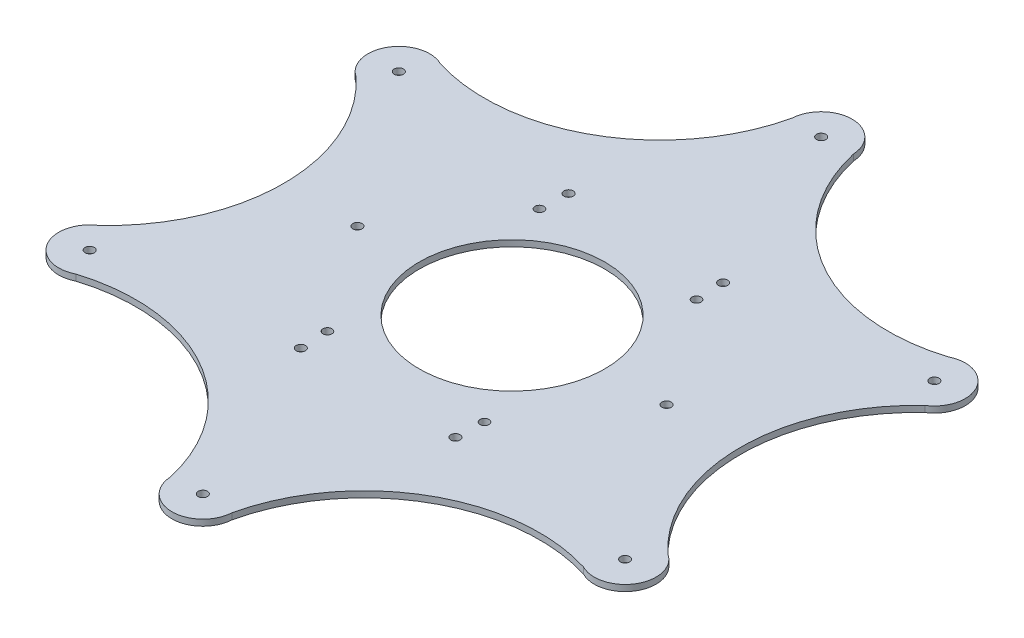
ISO-10303-21;
HEADER;
FILE_DESCRIPTION(('STEP AP214'),'2;1');
FILE_NAME('part.step','',(''),(''),'','','');
FILE_SCHEMA(('AUTOMOTIVE_DESIGN { 1 0 10303 214 1 1 1 1 }'));
ENDSEC;
DATA;
#1=APPLICATION_CONTEXT('core data for automotive mechanical design processes');
#2=APPLICATION_PROTOCOL_DEFINITION('international standard','automotive_design',2000,#1);
#3=PRODUCT_CONTEXT('',#1,'mechanical');
#4=PRODUCT('Part','Part','',(#3));
#5=PRODUCT_RELATED_PRODUCT_CATEGORY('part','',(#4));
#6=PRODUCT_DEFINITION_FORMATION('','',#4);
#7=PRODUCT_DEFINITION_CONTEXT('part definition',#1,'design');
#8=PRODUCT_DEFINITION('design','',#6,#7);
#9=PRODUCT_DEFINITION_SHAPE('','',#8);
#10=(LENGTH_UNIT() NAMED_UNIT(*) SI_UNIT(.MILLI.,.METRE.));
#11=(NAMED_UNIT(*) PLANE_ANGLE_UNIT() SI_UNIT($,.RADIAN.));
#12=(NAMED_UNIT(*) SI_UNIT($,.STERADIAN.) SOLID_ANGLE_UNIT());
#13=UNCERTAINTY_MEASURE_WITH_UNIT(LENGTH_MEASURE(1.E-05),#10,'distance_accuracy_value','');
#14=(GEOMETRIC_REPRESENTATION_CONTEXT(3) GLOBAL_UNCERTAINTY_ASSIGNED_CONTEXT((#13)) GLOBAL_UNIT_ASSIGNED_CONTEXT((#10,
#11,#12)) REPRESENTATION_CONTEXT('',''));
#15=CARTESIAN_POINT('',(0.,0.,0.));
#16=DIRECTION('',(0.,0.,1.));
#17=DIRECTION('',(1.,0.,0.));
#18=AXIS2_PLACEMENT_3D('',#15,#16,#17);
#19=CARTESIAN_POINT('',(-108.618711885218,2.,-25.0003901152635));
#20=DIRECTION('',(0.,1.,0.));
#21=DIRECTION('',(0.,0.,1.));
#22=AXIS2_PLACEMENT_3D('',#19,#20,#21);
#23=PLANE('',#22);
#24=CARTESIAN_POINT('',(-25.4,2.,-34.29));
#25=DIRECTION('',(0.,1.,0.));
#26=DIRECTION('',(0.,0.,1.));
#27=AXIS2_PLACEMENT_3D('',#24,#25,#26);
#28=CIRCLE('',#27,1.45);
#29=CARTESIAN_POINT('',(-25.4,2.,-32.84));
#30=VERTEX_POINT('',#29);
#31=EDGE_CURVE('E379',#30,#30,#28,.T.);
#32=ORIENTED_EDGE('',*,*,#31,.F.);
#33=EDGE_LOOP('',(#32));
#34=FACE_BOUND('',#33,.T.);
#35=CARTESIAN_POINT('',(25.4,2.,-34.29));
#36=DIRECTION('',(0.,1.,0.));
#37=DIRECTION('',(0.,0.,1.));
#38=AXIS2_PLACEMENT_3D('',#35,#36,#37);
#39=CIRCLE('',#38,1.45);
#40=CARTESIAN_POINT('',(25.4,2.,-32.84));
#41=VERTEX_POINT('',#40);
#42=EDGE_CURVE('E383',#41,#41,#39,.T.);
#43=ORIENTED_EDGE('',*,*,#42,.F.);
#44=EDGE_LOOP('',(#43));
#45=FACE_BOUND('',#44,.T.);
#46=CARTESIAN_POINT('',(25.4,2.,34.29));
#47=DIRECTION('',(0.,1.,0.));
#48=DIRECTION('',(0.,0.,1.));
#49=AXIS2_PLACEMENT_3D('',#46,#47,#48);
#50=CIRCLE('',#49,1.45);
#51=CARTESIAN_POINT('',(25.4,2.,35.74));
#52=VERTEX_POINT('',#51);
#53=EDGE_CURVE('E393',#52,#52,#50,.T.);
#54=ORIENTED_EDGE('',*,*,#53,.F.);
#55=EDGE_LOOP('',(#54));
#56=FACE_BOUND('',#55,.T.);
#57=CARTESIAN_POINT('',(-25.4,2.,34.29));
#58=DIRECTION('',(0.,1.,0.));
#59=DIRECTION('',(0.,0.,1.));
#60=AXIS2_PLACEMENT_3D('',#57,#58,#59);
#61=CIRCLE('',#60,1.45);
#62=CARTESIAN_POINT('',(-25.4,2.,35.74));
#63=VERTEX_POINT('',#62);
#64=EDGE_CURVE('E401',#63,#63,#61,.T.);
#65=ORIENTED_EDGE('',*,*,#64,.F.);
#66=EDGE_LOOP('',(#65));
#67=FACE_BOUND('',#66,.T.);
#68=CARTESIAN_POINT('',(0.,2.,0.));
#69=DIRECTION('',(0.,-1.,0.));
#70=DIRECTION('',(0.,0.,-1.));
#71=AXIS2_PLACEMENT_3D('',#68,#69,#70);
#72=CIRCLE('',#71,30.);
#73=CARTESIAN_POINT('',(0.,2.,-30.));
#74=VERTEX_POINT('',#73);
#75=EDGE_CURVE('E410',#74,#74,#72,.T.);
#76=ORIENTED_EDGE('',*,*,#75,.T.);
#77=EDGE_LOOP('',(#76));
#78=FACE_BOUND('',#77,.T.);
#79=CARTESIAN_POINT('',(-50.,2.,0.));
#80=DIRECTION('',(0.,1.,0.));
#81=DIRECTION('',(0.,0.,-1.));
#82=AXIS2_PLACEMENT_3D('',#79,#80,#81);
#83=CIRCLE('',#82,1.5);
#84=CARTESIAN_POINT('',(-50.,2.,-1.50000000000007));
#85=VERTEX_POINT('',#84);
#86=EDGE_CURVE('E426',#85,#85,#83,.T.);
#87=ORIENTED_EDGE('',*,*,#86,.F.);
#88=EDGE_LOOP('',(#87));
#89=FACE_BOUND('',#88,.T.);
#90=CARTESIAN_POINT('',(50.,2.,0.));
#91=DIRECTION('',(0.,1.,0.));
#92=DIRECTION('',(0.,0.,-1.));
#93=AXIS2_PLACEMENT_3D('',#90,#91,#92);
#94=CIRCLE('',#93,1.5);
#95=CARTESIAN_POINT('',(50.,2.,-1.49999999999991));
#96=VERTEX_POINT('',#95);
#97=EDGE_CURVE('E442',#96,#96,#94,.T.);
#98=ORIENTED_EDGE('',*,*,#97,.F.);
#99=EDGE_LOOP('',(#98));
#100=FACE_BOUND('',#99,.T.);
#101=CARTESIAN_POINT('',(-25.,2.,-43.301270189222));
#102=DIRECTION('',(0.,1.,0.));
#103=DIRECTION('',(0.,0.,-1.));
#104=AXIS2_PLACEMENT_3D('',#101,#102,#103);
#105=CIRCLE('',#104,1.5);
#106=CARTESIAN_POINT('',(-25.,2.,-44.801270189222));
#107=VERTEX_POINT('',#106);
#108=EDGE_CURVE('E458',#107,#107,#105,.T.);
#109=ORIENTED_EDGE('',*,*,#108,.F.);
#110=EDGE_LOOP('',(#109));
#111=FACE_BOUND('',#110,.T.);
#112=CARTESIAN_POINT('',(-86.6025403784438,2.,-50.));
#113=DIRECTION('',(0.,1.,0.));
#114=DIRECTION('',(0.,0.,-1.));
#115=AXIS2_PLACEMENT_3D('',#112,#113,#114);
#116=CIRCLE('',#115,1.5);
#117=CARTESIAN_POINT('',(-86.6025403784438,2.,-51.5));
#118=VERTEX_POINT('',#117);
#119=EDGE_CURVE('E474',#118,#118,#116,.T.);
#120=ORIENTED_EDGE('',*,*,#119,.F.);
#121=EDGE_LOOP('',(#120));
#122=FACE_BOUND('',#121,.T.);
#123=CARTESIAN_POINT('',(0.,2.,100.));
#124=DIRECTION('',(0.,1.,0.));
#125=DIRECTION('',(0.,0.,-1.));
#126=AXIS2_PLACEMENT_3D('',#123,#124,#125);
#127=CIRCLE('',#126,1.5);
#128=CARTESIAN_POINT('',(0.,2.,98.5));
#129=VERTEX_POINT('',#128);
#130=EDGE_CURVE('E490',#129,#129,#127,.T.);
#131=ORIENTED_EDGE('',*,*,#130,.F.);
#132=EDGE_LOOP('',(#131));
#133=FACE_BOUND('',#132,.T.);
#134=CARTESIAN_POINT('',(86.6025403784438,2.,-50.));
#135=DIRECTION('',(0.,1.,0.));
#136=DIRECTION('',(0.,0.,-1.));
#137=AXIS2_PLACEMENT_3D('',#134,#135,#136);
#138=CIRCLE('',#137,1.5);
#139=CARTESIAN_POINT('',(86.6025403784438,2.,-51.5));
#140=VERTEX_POINT('',#139);
#141=EDGE_CURVE('E172',#140,#140,#138,.T.);
#142=ORIENTED_EDGE('',*,*,#141,.F.);
#143=EDGE_LOOP('',(#142));
#144=FACE_BOUND('',#143,.T.);
#145=CARTESIAN_POINT('',(-86.6025403784438,2.,-50.));
#146=DIRECTION('',(0.,1.,0.));
#147=DIRECTION('',(0.,0.,1.));
#148=AXIS2_PLACEMENT_3D('',#145,#146,#147);
#149=CIRCLE('',#148,10.);
#150=CARTESIAN_POINT('',(-82.0595487537895,2.,-58.908491853188));
#151=VERTEX_POINT('',#150);
#152=CARTESIAN_POINT('',(-92.0404323403085,2.,-41.6077815202958));
#153=VERTEX_POINT('',#152);
#154=EDGE_CURVE('E202',#151,#153,#149,.T.);
#155=ORIENTED_EDGE('',*,*,#154,.T.);
#156=CARTESIAN_POINT('',(-130.634883391993,2.,-0.000780230526946419));
#157=DIRECTION('',(0.,-1.,0.));
#158=DIRECTION('',(0.,0.,-1.));
#159=AXIS2_PLACEMENT_3D('',#156,#157,#158);
#160=CIRCLE('',#159,56.7509842056303);
#161=CARTESIAN_POINT('',(-92.0460248203844,2.,41.6114079172753));
#162=VERTEX_POINT('',#161);
#163=EDGE_CURVE('E114',#153,#162,#160,.T.);
#164=ORIENTED_EDGE('',*,*,#163,.T.);
#165=CARTESIAN_POINT('',(-86.6025403784438,2.,50.));
#166=DIRECTION('',(0.,1.,0.));
#167=DIRECTION('',(0.,0.,1.));
#168=AXIS2_PLACEMENT_3D('',#165,#166,#167);
#169=CIRCLE('',#168,10.);
#170=CARTESIAN_POINT('',(-82.0536119618431,2.,58.905461821862));
#171=VERTEX_POINT('',#170);
#172=EDGE_CURVE('E239',#162,#171,#169,.T.);
#173=ORIENTED_EDGE('',*,*,#172,.T.);
#174=CARTESIAN_POINT('',(-65.3181173954537,2.,113.132737522621));
#175=DIRECTION('',(0.,-1.,0.));
#176=DIRECTION('',(0.,0.,-1.));
#177=AXIS2_PLACEMENT_3D('',#174,#175,#176);
#178=CIRCLE('',#177,56.7509842056308);
#179=CARTESIAN_POINT('',(-9.98647606659472,2.,100.519899770463));
#180=VERTEX_POINT('',#179);
#181=EDGE_CURVE('E259',#171,#180,#178,.T.);
#182=ORIENTED_EDGE('',*,*,#181,.T.);
#183=CARTESIAN_POINT('',(0.,2.,100.));
#184=DIRECTION('',(0.,1.,0.));
#185=DIRECTION('',(0.,0.,1.));
#186=AXIS2_PLACEMENT_3D('',#183,#184,#185);
#187=CIRCLE('',#186,9.99999999999997);
#188=CARTESIAN_POINT('',(9.98682037846526,2.,100.513243342158));
#189=VERTEX_POINT('',#188);
#190=EDGE_CURVE('E255',#180,#189,#187,.T.);
#191=ORIENTED_EDGE('',*,*,#190,.T.);
#192=CARTESIAN_POINT('',(65.3167659965395,2.,113.133517753148));
#193=DIRECTION('',(0.,-1.,0.));
#194=DIRECTION('',(0.,0.,-1.));
#195=AXIS2_PLACEMENT_3D('',#192,#193,#194);
#196=CIRCLE('',#195,56.7509842056308);
#197=CARTESIAN_POINT('',(82.0595487537894,2.,58.9084918531884));
#198=VERTEX_POINT('',#197);
#199=EDGE_CURVE('E258',#189,#198,#196,.T.);
#200=ORIENTED_EDGE('',*,*,#199,.T.);
#201=CARTESIAN_POINT('',(86.6025403784438,2.,50.));
#202=DIRECTION('',(0.,1.,0.));
#203=DIRECTION('',(0.,0.,1.));
#204=AXIS2_PLACEMENT_3D('',#201,#202,#203);
#205=CIRCLE('',#204,9.99999999999995);
#206=CARTESIAN_POINT('',(92.0404323403084,2.,41.6077815202959));
#207=VERTEX_POINT('',#206);
#208=EDGE_CURVE('E263',#198,#207,#205,.T.);
#209=ORIENTED_EDGE('',*,*,#208,.T.);
#210=CARTESIAN_POINT('',(130.634883391993,2.,0.000780230527053709));
#211=DIRECTION('',(0.,-1.,0.));
#212=DIRECTION('',(0.,0.,-1.));
#213=AXIS2_PLACEMENT_3D('',#210,#211,#212);
#214=CIRCLE('',#213,56.7509842056303);
#215=CARTESIAN_POINT('',(92.0460248203844,2.,-41.6114079172752));
#216=VERTEX_POINT('',#215);
#217=EDGE_CURVE('E270',#207,#216,#214,.T.);
#218=ORIENTED_EDGE('',*,*,#217,.T.);
#219=CARTESIAN_POINT('',(86.6025403784438,2.,-50.));
#220=DIRECTION('',(0.,1.,0.));
#221=DIRECTION('',(0.,0.,1.));
#222=AXIS2_PLACEMENT_3D('',#219,#220,#221);
#223=CIRCLE('',#222,10.);
#224=CARTESIAN_POINT('',(82.0536119618431,2.,-58.9054618218621));
#225=VERTEX_POINT('',#224);
#226=EDGE_CURVE('E145',#216,#225,#223,.T.);
#227=ORIENTED_EDGE('',*,*,#226,.T.);
#228=CARTESIAN_POINT('',(65.3181173954538,2.,-113.132737522621));
#229=DIRECTION('',(0.,-1.,0.));
#230=DIRECTION('',(0.,0.,-1.));
#231=AXIS2_PLACEMENT_3D('',#228,#229,#230);
#232=CIRCLE('',#231,56.7509842056308);
#233=CARTESIAN_POINT('',(9.9864760665948,2.,-100.519899770463));
#234=VERTEX_POINT('',#233);
#235=EDGE_CURVE('E139',#225,#234,#232,.T.);
#236=ORIENTED_EDGE('',*,*,#235,.T.);
#237=CARTESIAN_POINT('',(0.,2.,-100.));
#238=DIRECTION('',(0.,1.,0.));
#239=DIRECTION('',(0.,0.,1.));
#240=AXIS2_PLACEMENT_3D('',#237,#238,#239);
#241=CIRCLE('',#240,9.99999999999999);
#242=CARTESIAN_POINT('',(-9.98682037846531,2.,-100.513243342158));
#243=VERTEX_POINT('',#242);
#244=EDGE_CURVE('E143',#234,#243,#241,.T.);
#245=ORIENTED_EDGE('',*,*,#244,.T.);
#246=CARTESIAN_POINT('',(-65.3167659965395,2.,-113.133517753147));
#247=DIRECTION('',(0.,-1.,0.));
#248=DIRECTION('',(0.,0.,-1.));
#249=AXIS2_PLACEMENT_3D('',#246,#247,#248);
#250=CIRCLE('',#249,56.7509842056302);
#251=EDGE_CURVE('E59',#243,#151,#250,.T.);
#252=ORIENTED_EDGE('',*,*,#251,.T.);
#253=EDGE_LOOP('',(#155,#164,#173,#182,#191,#200,#209,#218,#227,#236,#245,#252));
#254=FACE_BOUND('',#253,.T.);
#255=CARTESIAN_POINT('',(86.6025403784438,2.,50.));
#256=DIRECTION('',(0.,1.,0.));
#257=DIRECTION('',(0.,0.,-1.));
#258=AXIS2_PLACEMENT_3D('',#255,#256,#257);
#259=CIRCLE('',#258,1.5);
#260=CARTESIAN_POINT('',(86.6025403784438,2.,48.5));
#261=VERTEX_POINT('',#260);
#262=EDGE_CURVE('E498',#261,#261,#259,.T.);
#263=ORIENTED_EDGE('',*,*,#262,.F.);
#264=EDGE_LOOP('',(#263));
#265=FACE_BOUND('',#264,.T.);
#266=CARTESIAN_POINT('',(-86.6025403784438,2.,50.));
#267=DIRECTION('',(0.,1.,0.));
#268=DIRECTION('',(0.,0.,-1.));
#269=AXIS2_PLACEMENT_3D('',#266,#267,#268);
#270=CIRCLE('',#269,1.5);
#271=CARTESIAN_POINT('',(-86.6025403784438,2.,48.5));
#272=VERTEX_POINT('',#271);
#273=EDGE_CURVE('E482',#272,#272,#270,.T.);
#274=ORIENTED_EDGE('',*,*,#273,.F.);
#275=EDGE_LOOP('',(#274));
#276=FACE_BOUND('',#275,.T.);
#277=CARTESIAN_POINT('',(0.,2.,-100.));
#278=DIRECTION('',(0.,1.,0.));
#279=DIRECTION('',(0.,0.,-1.));
#280=AXIS2_PLACEMENT_3D('',#277,#278,#279);
#281=CIRCLE('',#280,1.5);
#282=CARTESIAN_POINT('',(0.,2.,-101.5));
#283=VERTEX_POINT('',#282);
#284=EDGE_CURVE('E466',#283,#283,#281,.T.);
#285=ORIENTED_EDGE('',*,*,#284,.F.);
#286=EDGE_LOOP('',(#285));
#287=FACE_BOUND('',#286,.T.);
#288=CARTESIAN_POINT('',(25.,2.,-43.3012701892219));
#289=DIRECTION('',(0.,1.,0.));
#290=DIRECTION('',(0.,0.,-1.));
#291=AXIS2_PLACEMENT_3D('',#288,#289,#290);
#292=CIRCLE('',#291,1.5);
#293=CARTESIAN_POINT('',(25.,2.,-44.8012701892219));
#294=VERTEX_POINT('',#293);
#295=EDGE_CURVE('E450',#294,#294,#292,.T.);
#296=ORIENTED_EDGE('',*,*,#295,.F.);
#297=EDGE_LOOP('',(#296));
#298=FACE_BOUND('',#297,.T.);
#299=CARTESIAN_POINT('',(25.,2.,43.301270189222));
#300=DIRECTION('',(0.,1.,0.));
#301=DIRECTION('',(0.,0.,-1.));
#302=AXIS2_PLACEMENT_3D('',#299,#300,#301);
#303=CIRCLE('',#302,1.5);
#304=CARTESIAN_POINT('',(25.,2.,41.801270189222));
#305=VERTEX_POINT('',#304);
#306=EDGE_CURVE('E434',#305,#305,#303,.T.);
#307=ORIENTED_EDGE('',*,*,#306,.F.);
#308=EDGE_LOOP('',(#307));
#309=FACE_BOUND('',#308,.T.);
#310=CARTESIAN_POINT('',(-25.,2.,43.3012701892219));
#311=DIRECTION('',(0.,1.,0.));
#312=DIRECTION('',(0.,0.,-1.));
#313=AXIS2_PLACEMENT_3D('',#310,#311,#312);
#314=CIRCLE('',#313,1.5);
#315=CARTESIAN_POINT('',(-25.,2.,41.8012701892219));
#316=VERTEX_POINT('',#315);
#317=EDGE_CURVE('E418',#316,#316,#314,.T.);
#318=ORIENTED_EDGE('',*,*,#317,.F.);
#319=EDGE_LOOP('',(#318));
#320=FACE_BOUND('',#319,.T.);
#321=ADVANCED_FACE('F41',(#34,#45,#56,#67,#78,#89,#100,#111,#122,#133,#144,#254,#265,#276,#287,
#298,#309,#320),#23,.T.);
#322=CARTESIAN_POINT('',(-108.618711885218,0.,-25.0003901152635));
#323=DIRECTION('',(0.,1.,0.));
#324=DIRECTION('',(0.,0.,1.));
#325=AXIS2_PLACEMENT_3D('',#322,#323,#324);
#326=PLANE('',#325);
#327=CARTESIAN_POINT('',(-25.4,0.,-34.29));
#328=DIRECTION('',(0.,1.,0.));
#329=DIRECTION('',(0.,0.,1.));
#330=AXIS2_PLACEMENT_3D('',#327,#328,#329);
#331=CIRCLE('',#330,1.45);
#332=CARTESIAN_POINT('',(-25.4,0.,-32.84));
#333=VERTEX_POINT('',#332);
#334=EDGE_CURVE('E377',#333,#333,#331,.T.);
#335=ORIENTED_EDGE('',*,*,#334,.T.);
#336=EDGE_LOOP('',(#335));
#337=FACE_BOUND('',#336,.T.);
#338=CARTESIAN_POINT('',(25.4,0.,-34.29));
#339=DIRECTION('',(0.,1.,0.));
#340=DIRECTION('',(0.,0.,1.));
#341=AXIS2_PLACEMENT_3D('',#338,#339,#340);
#342=CIRCLE('',#341,1.45);
#343=CARTESIAN_POINT('',(25.4,0.,-32.84));
#344=VERTEX_POINT('',#343);
#345=EDGE_CURVE('E389',#344,#344,#342,.T.);
#346=ORIENTED_EDGE('',*,*,#345,.T.);
#347=EDGE_LOOP('',(#346));
#348=FACE_BOUND('',#347,.T.);
#349=CARTESIAN_POINT('',(25.4,0.,34.29));
#350=DIRECTION('',(0.,1.,0.));
#351=DIRECTION('',(0.,0.,1.));
#352=AXIS2_PLACEMENT_3D('',#349,#350,#351);
#353=CIRCLE('',#352,1.45);
#354=CARTESIAN_POINT('',(25.4,0.,35.74));
#355=VERTEX_POINT('',#354);
#356=EDGE_CURVE('E397',#355,#355,#353,.T.);
#357=ORIENTED_EDGE('',*,*,#356,.T.);
#358=EDGE_LOOP('',(#357));
#359=FACE_BOUND('',#358,.T.);
#360=CARTESIAN_POINT('',(-25.4,0.,34.29));
#361=DIRECTION('',(0.,1.,0.));
#362=DIRECTION('',(0.,0.,1.));
#363=AXIS2_PLACEMENT_3D('',#360,#361,#362);
#364=CIRCLE('',#363,1.45);
#365=CARTESIAN_POINT('',(-25.4,0.,35.74));
#366=VERTEX_POINT('',#365);
#367=EDGE_CURVE('E405',#366,#366,#364,.T.);
#368=ORIENTED_EDGE('',*,*,#367,.T.);
#369=EDGE_LOOP('',(#368));
#370=FACE_BOUND('',#369,.T.);
#371=CARTESIAN_POINT('',(0.,0.,0.));
#372=DIRECTION('',(0.,-1.,0.));
#373=DIRECTION('',(0.,0.,-1.));
#374=AXIS2_PLACEMENT_3D('',#371,#372,#373);
#375=CIRCLE('',#374,30.);
#376=CARTESIAN_POINT('',(0.,0.,-30.));
#377=VERTEX_POINT('',#376);
#378=EDGE_CURVE('E409',#377,#377,#375,.T.);
#379=ORIENTED_EDGE('',*,*,#378,.F.);
#380=EDGE_LOOP('',(#379));
#381=FACE_BOUND('',#380,.T.);
#382=CARTESIAN_POINT('',(-86.6025403784438,0.,-50.));
#383=DIRECTION('',(0.,1.,0.));
#384=DIRECTION('',(0.,0.,1.));
#385=AXIS2_PLACEMENT_3D('',#382,#383,#384);
#386=CIRCLE('',#385,10.);
#387=CARTESIAN_POINT('',(-82.0595487537895,0.,-58.908491853188));
#388=VERTEX_POINT('',#387);
#389=CARTESIAN_POINT('',(-92.0404323403085,0.,-41.6077815202958));
#390=VERTEX_POINT('',#389);
#391=EDGE_CURVE('E167',#388,#390,#386,.T.);
#392=ORIENTED_EDGE('',*,*,#391,.F.);
#393=CARTESIAN_POINT('',(-65.3167659965395,0.,-113.133517753147));
#394=DIRECTION('',(0.,-1.,0.));
#395=DIRECTION('',(0.,0.,-1.));
#396=AXIS2_PLACEMENT_3D('',#393,#394,#395);
#397=CIRCLE('',#396,56.7509842056302);
#398=CARTESIAN_POINT('',(-9.98682037846531,0.,-100.513243342158));
#399=VERTEX_POINT('',#398);
#400=EDGE_CURVE('E106',#399,#388,#397,.T.);
#401=ORIENTED_EDGE('',*,*,#400,.F.);
#402=CARTESIAN_POINT('',(0.,0.,-100.));
#403=DIRECTION('',(0.,1.,0.));
#404=DIRECTION('',(0.,0.,1.));
#405=AXIS2_PLACEMENT_3D('',#402,#403,#404);
#406=CIRCLE('',#405,9.99999999999999);
#407=CARTESIAN_POINT('',(9.9864760665948,0.,-100.519899770463));
#408=VERTEX_POINT('',#407);
#409=EDGE_CURVE('E100',#408,#399,#406,.T.);
#410=ORIENTED_EDGE('',*,*,#409,.F.);
#411=CARTESIAN_POINT('',(65.3181173954538,0.,-113.132737522621));
#412=DIRECTION('',(0.,-1.,0.));
#413=DIRECTION('',(0.,0.,-1.));
#414=AXIS2_PLACEMENT_3D('',#411,#412,#413);
#415=CIRCLE('',#414,56.7509842056308);
#416=CARTESIAN_POINT('',(82.0536119618431,0.,-58.9054618218621));
#417=VERTEX_POINT('',#416);
#418=EDGE_CURVE('E154',#417,#408,#415,.T.);
#419=ORIENTED_EDGE('',*,*,#418,.F.);
#420=CARTESIAN_POINT('',(86.6025403784438,0.,-50.));
#421=DIRECTION('',(0.,1.,0.));
#422=DIRECTION('',(0.,0.,1.));
#423=AXIS2_PLACEMENT_3D('',#420,#421,#422);
#424=CIRCLE('',#423,10.);
#425=CARTESIAN_POINT('',(92.0460248203844,0.,-41.6114079172752));
#426=VERTEX_POINT('',#425);
#427=EDGE_CURVE('E193',#426,#417,#424,.T.);
#428=ORIENTED_EDGE('',*,*,#427,.F.);
#429=CARTESIAN_POINT('',(130.634883391993,0.,0.000780230527053709));
#430=DIRECTION('',(0.,-1.,0.));
#431=DIRECTION('',(0.,0.,-1.));
#432=AXIS2_PLACEMENT_3D('',#429,#430,#431);
#433=CIRCLE('',#432,56.7509842056303);
#434=CARTESIAN_POINT('',(92.0404323403084,0.,41.6077815202959));
#435=VERTEX_POINT('',#434);
#436=EDGE_CURVE('E190',#435,#426,#433,.T.);
#437=ORIENTED_EDGE('',*,*,#436,.F.);
#438=CARTESIAN_POINT('',(86.6025403784438,0.,50.));
#439=DIRECTION('',(0.,1.,0.));
#440=DIRECTION('',(0.,0.,1.));
#441=AXIS2_PLACEMENT_3D('',#438,#439,#440);
#442=CIRCLE('',#441,9.99999999999995);
#443=CARTESIAN_POINT('',(82.0595487537894,0.,58.9084918531884));
#444=VERTEX_POINT('',#443);
#445=EDGE_CURVE('E187',#444,#435,#442,.T.);
#446=ORIENTED_EDGE('',*,*,#445,.F.);
#447=CARTESIAN_POINT('',(65.3167659965395,0.,113.133517753148));
#448=DIRECTION('',(0.,-1.,0.));
#449=DIRECTION('',(0.,0.,-1.));
#450=AXIS2_PLACEMENT_3D('',#447,#448,#449);
#451=CIRCLE('',#450,56.7509842056308);
#452=CARTESIAN_POINT('',(9.98682037846526,0.,100.513243342158));
#453=VERTEX_POINT('',#452);
#454=EDGE_CURVE('E184',#453,#444,#451,.T.);
#455=ORIENTED_EDGE('',*,*,#454,.F.);
#456=CARTESIAN_POINT('',(0.,0.,100.));
#457=DIRECTION('',(0.,1.,0.));
#458=DIRECTION('',(0.,0.,1.));
#459=AXIS2_PLACEMENT_3D('',#456,#457,#458);
#460=CIRCLE('',#459,9.99999999999997);
#461=CARTESIAN_POINT('',(-9.98647606659472,0.,100.519899770463));
#462=VERTEX_POINT('',#461);
#463=EDGE_CURVE('E181',#462,#453,#460,.T.);
#464=ORIENTED_EDGE('',*,*,#463,.F.);
#465=CARTESIAN_POINT('',(-65.3181173954537,0.,113.132737522621));
#466=DIRECTION('',(0.,-1.,0.));
#467=DIRECTION('',(0.,0.,-1.));
#468=AXIS2_PLACEMENT_3D('',#465,#466,#467);
#469=CIRCLE('',#468,56.7509842056308);
#470=CARTESIAN_POINT('',(-82.0536119618431,0.,58.905461821862));
#471=VERTEX_POINT('',#470);
#472=EDGE_CURVE('E178',#471,#462,#469,.T.);
#473=ORIENTED_EDGE('',*,*,#472,.F.);
#474=CARTESIAN_POINT('',(-86.6025403784438,0.,50.));
#475=DIRECTION('',(0.,1.,0.));
#476=DIRECTION('',(0.,0.,1.));
#477=AXIS2_PLACEMENT_3D('',#474,#475,#476);
#478=CIRCLE('',#477,10.);
#479=CARTESIAN_POINT('',(-92.0460248203844,0.,41.6114079172753));
#480=VERTEX_POINT('',#479);
#481=EDGE_CURVE('E175',#480,#471,#478,.T.);
#482=ORIENTED_EDGE('',*,*,#481,.F.);
#483=CARTESIAN_POINT('',(-130.634883391993,0.,-0.000780230526946419));
#484=DIRECTION('',(0.,-1.,0.));
#485=DIRECTION('',(0.,0.,-1.));
#486=AXIS2_PLACEMENT_3D('',#483,#484,#485);
#487=CIRCLE('',#486,56.7509842056303);
#488=EDGE_CURVE('E171',#390,#480,#487,.T.);
#489=ORIENTED_EDGE('',*,*,#488,.F.);
#490=EDGE_LOOP('',(#392,#401,#410,#419,#428,#437,#446,#455,#464,#473,#482,#489));
#491=FACE_BOUND('',#490,.T.);
#492=CARTESIAN_POINT('',(86.6025403784438,0.,-50.));
#493=DIRECTION('',(0.,1.,0.));
#494=DIRECTION('',(0.,0.,-1.));
#495=AXIS2_PLACEMENT_3D('',#492,#493,#494);
#496=CIRCLE('',#495,1.5);
#497=CARTESIAN_POINT('',(86.6025403784438,0.,-51.5));
#498=VERTEX_POINT('',#497);
#499=EDGE_CURVE('E502',#498,#498,#496,.T.);
#500=ORIENTED_EDGE('',*,*,#499,.T.);
#501=EDGE_LOOP('',(#500));
#502=FACE_BOUND('',#501,.T.);
#503=CARTESIAN_POINT('',(86.6025403784438,0.,50.));
#504=DIRECTION('',(0.,1.,0.));
#505=DIRECTION('',(0.,0.,-1.));
#506=AXIS2_PLACEMENT_3D('',#503,#504,#505);
#507=CIRCLE('',#506,1.5);
#508=CARTESIAN_POINT('',(86.6025403784438,0.,48.5));
#509=VERTEX_POINT('',#508);
#510=EDGE_CURVE('E494',#509,#509,#507,.T.);
#511=ORIENTED_EDGE('',*,*,#510,.T.);
#512=EDGE_LOOP('',(#511));
#513=FACE_BOUND('',#512,.T.);
#514=CARTESIAN_POINT('',(0.,0.,100.));
#515=DIRECTION('',(0.,1.,0.));
#516=DIRECTION('',(0.,0.,-1.));
#517=AXIS2_PLACEMENT_3D('',#514,#515,#516);
#518=CIRCLE('',#517,1.5);
#519=CARTESIAN_POINT('',(0.,0.,98.5));
#520=VERTEX_POINT('',#519);
#521=EDGE_CURVE('E486',#520,#520,#518,.T.);
#522=ORIENTED_EDGE('',*,*,#521,.T.);
#523=EDGE_LOOP('',(#522));
#524=FACE_BOUND('',#523,.T.);
#525=CARTESIAN_POINT('',(-86.6025403784438,0.,50.));
#526=DIRECTION('',(0.,1.,0.));
#527=DIRECTION('',(0.,0.,-1.));
#528=AXIS2_PLACEMENT_3D('',#525,#526,#527);
#529=CIRCLE('',#528,1.5);
#530=CARTESIAN_POINT('',(-86.6025403784438,0.,48.5));
#531=VERTEX_POINT('',#530);
#532=EDGE_CURVE('E478',#531,#531,#529,.T.);
#533=ORIENTED_EDGE('',*,*,#532,.T.);
#534=EDGE_LOOP('',(#533));
#535=FACE_BOUND('',#534,.T.);
#536=CARTESIAN_POINT('',(-86.6025403784438,0.,-50.));
#537=DIRECTION('',(0.,1.,0.));
#538=DIRECTION('',(0.,0.,-1.));
#539=AXIS2_PLACEMENT_3D('',#536,#537,#538);
#540=CIRCLE('',#539,1.5);
#541=CARTESIAN_POINT('',(-86.6025403784438,0.,-51.5));
#542=VERTEX_POINT('',#541);
#543=EDGE_CURVE('E470',#542,#542,#540,.T.);
#544=ORIENTED_EDGE('',*,*,#543,.T.);
#545=EDGE_LOOP('',(#544));
#546=FACE_BOUND('',#545,.T.);
#547=CARTESIAN_POINT('',(0.,0.,-100.));
#548=DIRECTION('',(0.,1.,0.));
#549=DIRECTION('',(0.,0.,-1.));
#550=AXIS2_PLACEMENT_3D('',#547,#548,#549);
#551=CIRCLE('',#550,1.5);
#552=CARTESIAN_POINT('',(0.,0.,-101.5));
#553=VERTEX_POINT('',#552);
#554=EDGE_CURVE('E462',#553,#553,#551,.T.);
#555=ORIENTED_EDGE('',*,*,#554,.T.);
#556=EDGE_LOOP('',(#555));
#557=FACE_BOUND('',#556,.T.);
#558=CARTESIAN_POINT('',(-25.,0.,-43.301270189222));
#559=DIRECTION('',(0.,1.,0.));
#560=DIRECTION('',(0.,0.,-1.));
#561=AXIS2_PLACEMENT_3D('',#558,#559,#560);
#562=CIRCLE('',#561,1.5);
#563=CARTESIAN_POINT('',(-25.,0.,-44.801270189222));
#564=VERTEX_POINT('',#563);
#565=EDGE_CURVE('E454',#564,#564,#562,.T.);
#566=ORIENTED_EDGE('',*,*,#565,.T.);
#567=EDGE_LOOP('',(#566));
#568=FACE_BOUND('',#567,.T.);
#569=CARTESIAN_POINT('',(25.,0.,-43.3012701892219));
#570=DIRECTION('',(0.,1.,0.));
#571=DIRECTION('',(0.,0.,-1.));
#572=AXIS2_PLACEMENT_3D('',#569,#570,#571);
#573=CIRCLE('',#572,1.5);
#574=CARTESIAN_POINT('',(25.,0.,-44.8012701892219));
#575=VERTEX_POINT('',#574);
#576=EDGE_CURVE('E446',#575,#575,#573,.T.);
#577=ORIENTED_EDGE('',*,*,#576,.T.);
#578=EDGE_LOOP('',(#577));
#579=FACE_BOUND('',#578,.T.);
#580=CARTESIAN_POINT('',(50.,0.,0.));
#581=DIRECTION('',(0.,1.,0.));
#582=DIRECTION('',(0.,0.,-1.));
#583=AXIS2_PLACEMENT_3D('',#580,#581,#582);
#584=CIRCLE('',#583,1.5);
#585=CARTESIAN_POINT('',(50.,0.,-1.49999999999991));
#586=VERTEX_POINT('',#585);
#587=EDGE_CURVE('E438',#586,#586,#584,.T.);
#588=ORIENTED_EDGE('',*,*,#587,.T.);
#589=EDGE_LOOP('',(#588));
#590=FACE_BOUND('',#589,.T.);
#591=CARTESIAN_POINT('',(25.,0.,43.301270189222));
#592=DIRECTION('',(0.,1.,0.));
#593=DIRECTION('',(0.,0.,-1.));
#594=AXIS2_PLACEMENT_3D('',#591,#592,#593);
#595=CIRCLE('',#594,1.5);
#596=CARTESIAN_POINT('',(25.,0.,41.801270189222));
#597=VERTEX_POINT('',#596);
#598=EDGE_CURVE('E430',#597,#597,#595,.T.);
#599=ORIENTED_EDGE('',*,*,#598,.T.);
#600=EDGE_LOOP('',(#599));
#601=FACE_BOUND('',#600,.T.);
#602=CARTESIAN_POINT('',(-50.,0.,0.));
#603=DIRECTION('',(0.,1.,0.));
#604=DIRECTION('',(0.,0.,-1.));
#605=AXIS2_PLACEMENT_3D('',#602,#603,#604);
#606=CIRCLE('',#605,1.5);
#607=CARTESIAN_POINT('',(-50.,0.,-1.50000000000007));
#608=VERTEX_POINT('',#607);
#609=EDGE_CURVE('E422',#608,#608,#606,.T.);
#610=ORIENTED_EDGE('',*,*,#609,.T.);
#611=EDGE_LOOP('',(#610));
#612=FACE_BOUND('',#611,.T.);
#613=CARTESIAN_POINT('',(-25.,0.,43.3012701892219));
#614=DIRECTION('',(0.,1.,0.));
#615=DIRECTION('',(0.,0.,-1.));
#616=AXIS2_PLACEMENT_3D('',#613,#614,#615);
#617=CIRCLE('',#616,1.5);
#618=CARTESIAN_POINT('',(-25.,0.,41.8012701892219));
#619=VERTEX_POINT('',#618);
#620=EDGE_CURVE('E414',#619,#619,#617,.T.);
#621=ORIENTED_EDGE('',*,*,#620,.T.);
#622=EDGE_LOOP('',(#621));
#623=FACE_BOUND('',#622,.T.);
#624=ADVANCED_FACE('F243',(#337,#348,#359,#370,#381,#491,#502,#513,#524,#535,#546,#557,#568,
#579,#590,#601,#612,#623),#326,.F.);
#625=CARTESIAN_POINT('',(-86.6025403784438,2.,-50.));
#626=DIRECTION('',(0.,-1.,0.));
#627=DIRECTION('',(0.,0.,-1.));
#628=AXIS2_PLACEMENT_3D('',#625,#626,#627);
#629=CYLINDRICAL_SURFACE('',#628,10.);
#630=ORIENTED_EDGE('',*,*,#391,.T.);
#631=DIRECTION('',(0.,-1.,0.));
#632=VECTOR('',#631,1.);
#633=CARTESIAN_POINT('',(-92.0404323403085,2.,-41.6077815202958));
#634=LINE('',#633,#632);
#635=EDGE_CURVE('E11',#153,#390,#634,.T.);
#636=ORIENTED_EDGE('',*,*,#635,.F.);
#637=ORIENTED_EDGE('',*,*,#154,.F.);
#638=DIRECTION('',(0.,-1.,0.));
#639=VECTOR('',#638,1.);
#640=CARTESIAN_POINT('',(-82.0595487537895,2.,-58.908491853188));
#641=LINE('',#640,#639);
#642=EDGE_CURVE('E163',#151,#388,#641,.T.);
#643=ORIENTED_EDGE('',*,*,#642,.T.);
#644=EDGE_LOOP('',(#630,#636,#637,#643));
#645=FACE_BOUND('',#644,.T.);
#646=ADVANCED_FACE('F43',(#645),#629,.T.);
#647=CARTESIAN_POINT('',(-130.634883391993,2.,-0.000780230526946419));
#648=DIRECTION('',(0.,-1.,0.));
#649=DIRECTION('',(0.,0.,-1.));
#650=AXIS2_PLACEMENT_3D('',#647,#648,#649);
#651=CYLINDRICAL_SURFACE('',#650,56.7509842056303);
#652=ORIENTED_EDGE('',*,*,#488,.T.);
#653=DIRECTION('',(0.,-1.,0.));
#654=VECTOR('',#653,1.);
#655=CARTESIAN_POINT('',(-92.0460248203844,2.,41.6114079172753));
#656=LINE('',#655,#654);
#657=EDGE_CURVE('E51',#162,#480,#656,.T.);
#658=ORIENTED_EDGE('',*,*,#657,.F.);
#659=ORIENTED_EDGE('',*,*,#163,.F.);
#660=ORIENTED_EDGE('',*,*,#635,.T.);
#661=EDGE_LOOP('',(#652,#658,#659,#660));
#662=FACE_BOUND('',#661,.T.);
#663=ADVANCED_FACE('F736',(#662),#651,.F.);
#664=CARTESIAN_POINT('',(-86.6025403784438,2.,50.));
#665=DIRECTION('',(0.,-1.,0.));
#666=DIRECTION('',(0.,0.,-1.));
#667=AXIS2_PLACEMENT_3D('',#664,#665,#666);
#668=CYLINDRICAL_SURFACE('',#667,10.);
#669=ORIENTED_EDGE('',*,*,#481,.T.);
#670=DIRECTION('',(0.,-1.,0.));
#671=VECTOR('',#670,1.);
#672=CARTESIAN_POINT('',(-82.0536119618431,2.,58.905461821862));
#673=LINE('',#672,#671);
#674=EDGE_CURVE('E229',#171,#471,#673,.T.);
#675=ORIENTED_EDGE('',*,*,#674,.F.);
#676=ORIENTED_EDGE('',*,*,#172,.F.);
#677=ORIENTED_EDGE('',*,*,#657,.T.);
#678=EDGE_LOOP('',(#669,#675,#676,#677));
#679=FACE_BOUND('',#678,.T.);
#680=ADVANCED_FACE('F237',(#679),#668,.T.);
#681=CARTESIAN_POINT('',(-65.3181173954537,2.,113.132737522621));
#682=DIRECTION('',(0.,-1.,0.));
#683=DIRECTION('',(0.,0.,-1.));
#684=AXIS2_PLACEMENT_3D('',#681,#682,#683);
#685=CYLINDRICAL_SURFACE('',#684,56.7509842056308);
#686=ORIENTED_EDGE('',*,*,#472,.T.);
#687=DIRECTION('',(0.,-1.,0.));
#688=VECTOR('',#687,1.);
#689=CARTESIAN_POINT('',(-9.98647606659472,2.,100.519899770463));
#690=LINE('',#689,#688);
#691=EDGE_CURVE('E225',#180,#462,#690,.T.);
#692=ORIENTED_EDGE('',*,*,#691,.F.);
#693=ORIENTED_EDGE('',*,*,#181,.F.);
#694=ORIENTED_EDGE('',*,*,#674,.T.);
#695=EDGE_LOOP('',(#686,#692,#693,#694));
#696=FACE_BOUND('',#695,.T.);
#697=ADVANCED_FACE('F249',(#696),#685,.F.);
#698=CARTESIAN_POINT('',(0.,2.,100.));
#699=DIRECTION('',(0.,-1.,0.));
#700=DIRECTION('',(0.,0.,-1.));
#701=AXIS2_PLACEMENT_3D('',#698,#699,#700);
#702=CYLINDRICAL_SURFACE('',#701,9.99999999999997);
#703=ORIENTED_EDGE('',*,*,#463,.T.);
#704=DIRECTION('',(0.,-1.,0.));
#705=VECTOR('',#704,1.);
#706=CARTESIAN_POINT('',(9.98682037846526,2.,100.513243342158));
#707=LINE('',#706,#705);
#708=EDGE_CURVE('E221',#189,#453,#707,.T.);
#709=ORIENTED_EDGE('',*,*,#708,.F.);
#710=ORIENTED_EDGE('',*,*,#190,.F.);
#711=ORIENTED_EDGE('',*,*,#691,.T.);
#712=EDGE_LOOP('',(#703,#709,#710,#711));
#713=FACE_BOUND('',#712,.T.);
#714=ADVANCED_FACE('F253',(#713),#702,.T.);
#715=CARTESIAN_POINT('',(65.3167659965395,2.,113.133517753148));
#716=DIRECTION('',(0.,-1.,0.));
#717=DIRECTION('',(0.,0.,-1.));
#718=AXIS2_PLACEMENT_3D('',#715,#716,#717);
#719=CYLINDRICAL_SURFACE('',#718,56.7509842056308);
#720=ORIENTED_EDGE('',*,*,#454,.T.);
#721=DIRECTION('',(0.,-1.,0.));
#722=VECTOR('',#721,1.);
#723=CARTESIAN_POINT('',(82.0595487537894,2.,58.9084918531884));
#724=LINE('',#723,#722);
#725=EDGE_CURVE('E217',#198,#444,#724,.T.);
#726=ORIENTED_EDGE('',*,*,#725,.F.);
#727=ORIENTED_EDGE('',*,*,#199,.F.);
#728=ORIENTED_EDGE('',*,*,#708,.T.);
#729=EDGE_LOOP('',(#720,#726,#727,#728));
#730=FACE_BOUND('',#729,.T.);
#731=ADVANCED_FACE('F701',(#730),#719,.F.);
#732=CARTESIAN_POINT('',(86.6025403784438,2.,50.));
#733=DIRECTION('',(0.,-1.,0.));
#734=DIRECTION('',(0.,0.,-1.));
#735=AXIS2_PLACEMENT_3D('',#732,#733,#734);
#736=CYLINDRICAL_SURFACE('',#735,9.99999999999995);
#737=ORIENTED_EDGE('',*,*,#445,.T.);
#738=DIRECTION('',(0.,-1.,0.));
#739=VECTOR('',#738,1.);
#740=CARTESIAN_POINT('',(92.0404323403084,2.,41.6077815202959));
#741=LINE('',#740,#739);
#742=EDGE_CURVE('E213',#207,#435,#741,.T.);
#743=ORIENTED_EDGE('',*,*,#742,.F.);
#744=ORIENTED_EDGE('',*,*,#208,.F.);
#745=ORIENTED_EDGE('',*,*,#725,.T.);
#746=EDGE_LOOP('',(#737,#743,#744,#745));
#747=FACE_BOUND('',#746,.T.);
#748=ADVANCED_FACE('F692',(#747),#736,.T.);
#749=CARTESIAN_POINT('',(130.634883391993,2.,0.000780230527053709));
#750=DIRECTION('',(0.,-1.,0.));
#751=DIRECTION('',(0.,0.,-1.));
#752=AXIS2_PLACEMENT_3D('',#749,#750,#751);
#753=CYLINDRICAL_SURFACE('',#752,56.7509842056303);
#754=ORIENTED_EDGE('',*,*,#436,.T.);
#755=DIRECTION('',(0.,-1.,0.));
#756=VECTOR('',#755,1.);
#757=CARTESIAN_POINT('',(92.0460248203844,2.,-41.6114079172752));
#758=LINE('',#757,#756);
#759=EDGE_CURVE('E209',#216,#426,#758,.T.);
#760=ORIENTED_EDGE('',*,*,#759,.F.);
#761=ORIENTED_EDGE('',*,*,#217,.F.);
#762=ORIENTED_EDGE('',*,*,#742,.T.);
#763=EDGE_LOOP('',(#754,#760,#761,#762));
#764=FACE_BOUND('',#763,.T.);
#765=ADVANCED_FACE('F278',(#764),#753,.F.);
#766=CARTESIAN_POINT('',(86.6025403784438,2.,-50.));
#767=DIRECTION('',(0.,-1.,0.));
#768=DIRECTION('',(0.,0.,-1.));
#769=AXIS2_PLACEMENT_3D('',#766,#767,#768);
#770=CYLINDRICAL_SURFACE('',#769,10.);
#771=ORIENTED_EDGE('',*,*,#427,.T.);
#772=DIRECTION('',(0.,-1.,0.));
#773=VECTOR('',#772,1.);
#774=CARTESIAN_POINT('',(82.0536119618431,2.,-58.9054618218621));
#775=LINE('',#774,#773);
#776=EDGE_CURVE('E156',#225,#417,#775,.T.);
#777=ORIENTED_EDGE('',*,*,#776,.F.);
#778=ORIENTED_EDGE('',*,*,#226,.F.);
#779=ORIENTED_EDGE('',*,*,#759,.T.);
#780=EDGE_LOOP('',(#771,#777,#778,#779));
#781=FACE_BOUND('',#780,.T.);
#782=ADVANCED_FACE('F282',(#781),#770,.T.);
#783=CARTESIAN_POINT('',(65.3181173954538,2.,-113.132737522621));
#784=DIRECTION('',(0.,-1.,0.));
#785=DIRECTION('',(0.,0.,-1.));
#786=AXIS2_PLACEMENT_3D('',#783,#784,#785);
#787=CYLINDRICAL_SURFACE('',#786,56.7509842056308);
#788=ORIENTED_EDGE('',*,*,#418,.T.);
#789=DIRECTION('',(0.,-1.,0.));
#790=VECTOR('',#789,1.);
#791=CARTESIAN_POINT('',(9.9864760665948,2.,-100.519899770463));
#792=LINE('',#791,#790);
#793=EDGE_CURVE('E151',#234,#408,#792,.T.);
#794=ORIENTED_EDGE('',*,*,#793,.F.);
#795=ORIENTED_EDGE('',*,*,#235,.F.);
#796=ORIENTED_EDGE('',*,*,#776,.T.);
#797=EDGE_LOOP('',(#788,#794,#795,#796));
#798=FACE_BOUND('',#797,.T.);
#799=ADVANCED_FACE('F152',(#798),#787,.F.);
#800=CARTESIAN_POINT('',(0.,2.,-100.));
#801=DIRECTION('',(0.,-1.,0.));
#802=DIRECTION('',(0.,0.,-1.));
#803=AXIS2_PLACEMENT_3D('',#800,#801,#802);
#804=CYLINDRICAL_SURFACE('',#803,9.99999999999999);
#805=ORIENTED_EDGE('',*,*,#409,.T.);
#806=DIRECTION('',(0.,-1.,0.));
#807=VECTOR('',#806,1.);
#808=CARTESIAN_POINT('',(-9.98682037846531,2.,-100.513243342158));
#809=LINE('',#808,#807);
#810=EDGE_CURVE('E157',#243,#399,#809,.T.);
#811=ORIENTED_EDGE('',*,*,#810,.F.);
#812=ORIENTED_EDGE('',*,*,#244,.F.);
#813=ORIENTED_EDGE('',*,*,#793,.T.);
#814=EDGE_LOOP('',(#805,#811,#812,#813));
#815=FACE_BOUND('',#814,.T.);
#816=ADVANCED_FACE('F159',(#815),#804,.T.);
#817=CARTESIAN_POINT('',(-65.3167659965395,2.,-113.133517753147));
#818=DIRECTION('',(0.,-1.,0.));
#819=DIRECTION('',(0.,0.,-1.));
#820=AXIS2_PLACEMENT_3D('',#817,#818,#819);
#821=CYLINDRICAL_SURFACE('',#820,56.7509842056302);
#822=ORIENTED_EDGE('',*,*,#400,.T.);
#823=ORIENTED_EDGE('',*,*,#642,.F.);
#824=ORIENTED_EDGE('',*,*,#251,.F.);
#825=ORIENTED_EDGE('',*,*,#810,.T.);
#826=EDGE_LOOP('',(#822,#823,#824,#825));
#827=FACE_BOUND('',#826,.T.);
#828=ADVANCED_FACE('F286',(#827),#821,.F.);
#829=CARTESIAN_POINT('',(86.6025403784438,2.,-50.));
#830=DIRECTION('',(0.,-1.,0.));
#831=DIRECTION('',(0.,0.,-1.));
#832=AXIS2_PLACEMENT_3D('',#829,#830,#831);
#833=CYLINDRICAL_SURFACE('',#832,1.5);
#834=ORIENTED_EDGE('',*,*,#141,.T.);
#835=EDGE_LOOP('',(#834));
#836=FACE_BOUND('',#835,.T.);
#837=ORIENTED_EDGE('',*,*,#499,.F.);
#838=EDGE_LOOP('',(#837));
#839=FACE_BOUND('',#838,.T.);
#840=ADVANCED_FACE('F288',(#836,#839),#833,.F.);
#841=CARTESIAN_POINT('',(86.6025403784438,2.,50.));
#842=DIRECTION('',(0.,-1.,0.));
#843=DIRECTION('',(0.,0.,-1.));
#844=AXIS2_PLACEMENT_3D('',#841,#842,#843);
#845=CYLINDRICAL_SURFACE('',#844,1.5);
#846=ORIENTED_EDGE('',*,*,#262,.T.);
#847=EDGE_LOOP('',(#846));
#848=FACE_BOUND('',#847,.T.);
#849=ORIENTED_EDGE('',*,*,#510,.F.);
#850=EDGE_LOOP('',(#849));
#851=FACE_BOUND('',#850,.T.);
#852=ADVANCED_FACE('F294',(#848,#851),#845,.F.);
#853=CARTESIAN_POINT('',(0.,2.,100.));
#854=DIRECTION('',(0.,-1.,0.));
#855=DIRECTION('',(0.,0.,-1.));
#856=AXIS2_PLACEMENT_3D('',#853,#854,#855);
#857=CYLINDRICAL_SURFACE('',#856,1.5);
#858=ORIENTED_EDGE('',*,*,#130,.T.);
#859=EDGE_LOOP('',(#858));
#860=FACE_BOUND('',#859,.T.);
#861=ORIENTED_EDGE('',*,*,#521,.F.);
#862=EDGE_LOOP('',(#861));
#863=FACE_BOUND('',#862,.T.);
#864=ADVANCED_FACE('F312',(#860,#863),#857,.F.);
#865=CARTESIAN_POINT('',(-86.6025403784438,2.,50.));
#866=DIRECTION('',(0.,-1.,0.));
#867=DIRECTION('',(0.,0.,-1.));
#868=AXIS2_PLACEMENT_3D('',#865,#866,#867);
#869=CYLINDRICAL_SURFACE('',#868,1.5);
#870=ORIENTED_EDGE('',*,*,#273,.T.);
#871=EDGE_LOOP('',(#870));
#872=FACE_BOUND('',#871,.T.);
#873=ORIENTED_EDGE('',*,*,#532,.F.);
#874=EDGE_LOOP('',(#873));
#875=FACE_BOUND('',#874,.T.);
#876=ADVANCED_FACE('F316',(#872,#875),#869,.F.);
#877=CARTESIAN_POINT('',(-86.6025403784438,2.,-50.));
#878=DIRECTION('',(0.,-1.,0.));
#879=DIRECTION('',(0.,0.,-1.));
#880=AXIS2_PLACEMENT_3D('',#877,#878,#879);
#881=CYLINDRICAL_SURFACE('',#880,1.5);
#882=ORIENTED_EDGE('',*,*,#119,.T.);
#883=EDGE_LOOP('',(#882));
#884=FACE_BOUND('',#883,.T.);
#885=ORIENTED_EDGE('',*,*,#543,.F.);
#886=EDGE_LOOP('',(#885));
#887=FACE_BOUND('',#886,.T.);
#888=ADVANCED_FACE('F320',(#884,#887),#881,.F.);
#889=CARTESIAN_POINT('',(0.,2.,-100.));
#890=DIRECTION('',(0.,-1.,0.));
#891=DIRECTION('',(0.,0.,-1.));
#892=AXIS2_PLACEMENT_3D('',#889,#890,#891);
#893=CYLINDRICAL_SURFACE('',#892,1.5);
#894=ORIENTED_EDGE('',*,*,#284,.T.);
#895=EDGE_LOOP('',(#894));
#896=FACE_BOUND('',#895,.T.);
#897=ORIENTED_EDGE('',*,*,#554,.F.);
#898=EDGE_LOOP('',(#897));
#899=FACE_BOUND('',#898,.T.);
#900=ADVANCED_FACE('F324',(#896,#899),#893,.F.);
#901=CARTESIAN_POINT('',(-25.,2.,-43.301270189222));
#902=DIRECTION('',(0.,-1.,0.));
#903=DIRECTION('',(0.,0.,-1.));
#904=AXIS2_PLACEMENT_3D('',#901,#902,#903);
#905=CYLINDRICAL_SURFACE('',#904,1.5);
#906=ORIENTED_EDGE('',*,*,#108,.T.);
#907=EDGE_LOOP('',(#906));
#908=FACE_BOUND('',#907,.T.);
#909=ORIENTED_EDGE('',*,*,#565,.F.);
#910=EDGE_LOOP('',(#909));
#911=FACE_BOUND('',#910,.T.);
#912=ADVANCED_FACE('F328',(#908,#911),#905,.F.);
#913=CARTESIAN_POINT('',(25.,2.,-43.3012701892219));
#914=DIRECTION('',(0.,-1.,0.));
#915=DIRECTION('',(0.,0.,-1.));
#916=AXIS2_PLACEMENT_3D('',#913,#914,#915);
#917=CYLINDRICAL_SURFACE('',#916,1.5);
#918=ORIENTED_EDGE('',*,*,#295,.T.);
#919=EDGE_LOOP('',(#918));
#920=FACE_BOUND('',#919,.T.);
#921=ORIENTED_EDGE('',*,*,#576,.F.);
#922=EDGE_LOOP('',(#921));
#923=FACE_BOUND('',#922,.T.);
#924=ADVANCED_FACE('F332',(#920,#923),#917,.F.);
#925=CARTESIAN_POINT('',(50.,2.,0.));
#926=DIRECTION('',(0.,-1.,0.));
#927=DIRECTION('',(0.,0.,-1.));
#928=AXIS2_PLACEMENT_3D('',#925,#926,#927);
#929=CYLINDRICAL_SURFACE('',#928,1.5);
#930=ORIENTED_EDGE('',*,*,#97,.T.);
#931=EDGE_LOOP('',(#930));
#932=FACE_BOUND('',#931,.T.);
#933=ORIENTED_EDGE('',*,*,#587,.F.);
#934=EDGE_LOOP('',(#933));
#935=FACE_BOUND('',#934,.T.);
#936=ADVANCED_FACE('F336',(#932,#935),#929,.F.);
#937=CARTESIAN_POINT('',(25.,2.,43.301270189222));
#938=DIRECTION('',(0.,-1.,0.));
#939=DIRECTION('',(0.,0.,-1.));
#940=AXIS2_PLACEMENT_3D('',#937,#938,#939);
#941=CYLINDRICAL_SURFACE('',#940,1.5);
#942=ORIENTED_EDGE('',*,*,#306,.T.);
#943=EDGE_LOOP('',(#942));
#944=FACE_BOUND('',#943,.T.);
#945=ORIENTED_EDGE('',*,*,#598,.F.);
#946=EDGE_LOOP('',(#945));
#947=FACE_BOUND('',#946,.T.);
#948=ADVANCED_FACE('F340',(#944,#947),#941,.F.);
#949=CARTESIAN_POINT('',(-50.,2.,0.));
#950=DIRECTION('',(0.,-1.,0.));
#951=DIRECTION('',(0.,0.,-1.));
#952=AXIS2_PLACEMENT_3D('',#949,#950,#951);
#953=CYLINDRICAL_SURFACE('',#952,1.5);
#954=ORIENTED_EDGE('',*,*,#86,.T.);
#955=EDGE_LOOP('',(#954));
#956=FACE_BOUND('',#955,.T.);
#957=ORIENTED_EDGE('',*,*,#609,.F.);
#958=EDGE_LOOP('',(#957));
#959=FACE_BOUND('',#958,.T.);
#960=ADVANCED_FACE('F344',(#956,#959),#953,.F.);
#961=CARTESIAN_POINT('',(-25.,2.,43.3012701892219));
#962=DIRECTION('',(0.,-1.,0.));
#963=DIRECTION('',(0.,0.,-1.));
#964=AXIS2_PLACEMENT_3D('',#961,#962,#963);
#965=CYLINDRICAL_SURFACE('',#964,1.5);
#966=ORIENTED_EDGE('',*,*,#317,.T.);
#967=EDGE_LOOP('',(#966));
#968=FACE_BOUND('',#967,.T.);
#969=ORIENTED_EDGE('',*,*,#620,.F.);
#970=EDGE_LOOP('',(#969));
#971=FACE_BOUND('',#970,.T.);
#972=ADVANCED_FACE('F348',(#968,#971),#965,.F.);
#973=CARTESIAN_POINT('',(0.,2.,0.));
#974=DIRECTION('',(0.,-1.,0.));
#975=DIRECTION('',(0.,0.,-1.));
#976=AXIS2_PLACEMENT_3D('',#973,#974,#975);
#977=CYLINDRICAL_SURFACE('',#976,30.);
#978=ORIENTED_EDGE('',*,*,#75,.F.);
#979=EDGE_LOOP('',(#978));
#980=FACE_BOUND('',#979,.T.);
#981=ORIENTED_EDGE('',*,*,#378,.T.);
#982=EDGE_LOOP('',(#981));
#983=FACE_BOUND('',#982,.T.);
#984=ADVANCED_FACE('F352',(#980,#983),#977,.F.);
#985=CARTESIAN_POINT('',(-25.4,2.,34.29));
#986=DIRECTION('',(0.,1.,0.));
#987=DIRECTION('',(0.,0.,1.));
#988=AXIS2_PLACEMENT_3D('',#985,#986,#987);
#989=CYLINDRICAL_SURFACE('',#988,1.45);
#990=ORIENTED_EDGE('',*,*,#367,.F.);
#991=EDGE_LOOP('',(#990));
#992=FACE_BOUND('',#991,.T.);
#993=ORIENTED_EDGE('',*,*,#64,.T.);
#994=EDGE_LOOP('',(#993));
#995=FACE_BOUND('',#994,.T.);
#996=ADVANCED_FACE('F356',(#992,#995),#989,.F.);
#997=CARTESIAN_POINT('',(25.4,2.,34.29));
#998=DIRECTION('',(0.,1.,0.));
#999=DIRECTION('',(0.,0.,1.));
#1000=AXIS2_PLACEMENT_3D('',#997,#998,#999);
#1001=CYLINDRICAL_SURFACE('',#1000,1.45);
#1002=ORIENTED_EDGE('',*,*,#356,.F.);
#1003=EDGE_LOOP('',(#1002));
#1004=FACE_BOUND('',#1003,.T.);
#1005=ORIENTED_EDGE('',*,*,#53,.T.);
#1006=EDGE_LOOP('',(#1005));
#1007=FACE_BOUND('',#1006,.T.);
#1008=ADVANCED_FACE('F360',(#1004,#1007),#1001,.F.);
#1009=CARTESIAN_POINT('',(25.4,2.,-34.29));
#1010=DIRECTION('',(0.,1.,0.));
#1011=DIRECTION('',(0.,0.,1.));
#1012=AXIS2_PLACEMENT_3D('',#1009,#1010,#1011);
#1013=CYLINDRICAL_SURFACE('',#1012,1.45);
#1014=ORIENTED_EDGE('',*,*,#345,.F.);
#1015=EDGE_LOOP('',(#1014));
#1016=FACE_BOUND('',#1015,.T.);
#1017=ORIENTED_EDGE('',*,*,#42,.T.);
#1018=EDGE_LOOP('',(#1017));
#1019=FACE_BOUND('',#1018,.T.);
#1020=ADVANCED_FACE('F364',(#1016,#1019),#1013,.F.);
#1021=CARTESIAN_POINT('',(-25.4,2.,-34.29));
#1022=DIRECTION('',(0.,1.,0.));
#1023=DIRECTION('',(0.,0.,1.));
#1024=AXIS2_PLACEMENT_3D('',#1021,#1022,#1023);
#1025=CYLINDRICAL_SURFACE('',#1024,1.45);
#1026=ORIENTED_EDGE('',*,*,#334,.F.);
#1027=EDGE_LOOP('',(#1026));
#1028=FACE_BOUND('',#1027,.T.);
#1029=ORIENTED_EDGE('',*,*,#31,.T.);
#1030=EDGE_LOOP('',(#1029));
#1031=FACE_BOUND('',#1030,.T.);
#1032=ADVANCED_FACE('F368',(#1028,#1031),#1025,.F.);
#1033=CLOSED_SHELL('',(#321,#624,#646,#663,#680,#697,#714,#731,#748,#765,#782,#799,#816,#828,
#840,#852,#864,#876,#888,#900,#912,#924,#936,#948,#960,#972,#984,#996,#1008,#1020,#1032));
#1034=MANIFOLD_SOLID_BREP('B2',#1033);
#1035=ADVANCED_BREP_SHAPE_REPRESENTATION('',(#18,#1034),#14);
#1036=SHAPE_DEFINITION_REPRESENTATION(#9,#1035);
ENDSEC;
END-ISO-10303-21;
